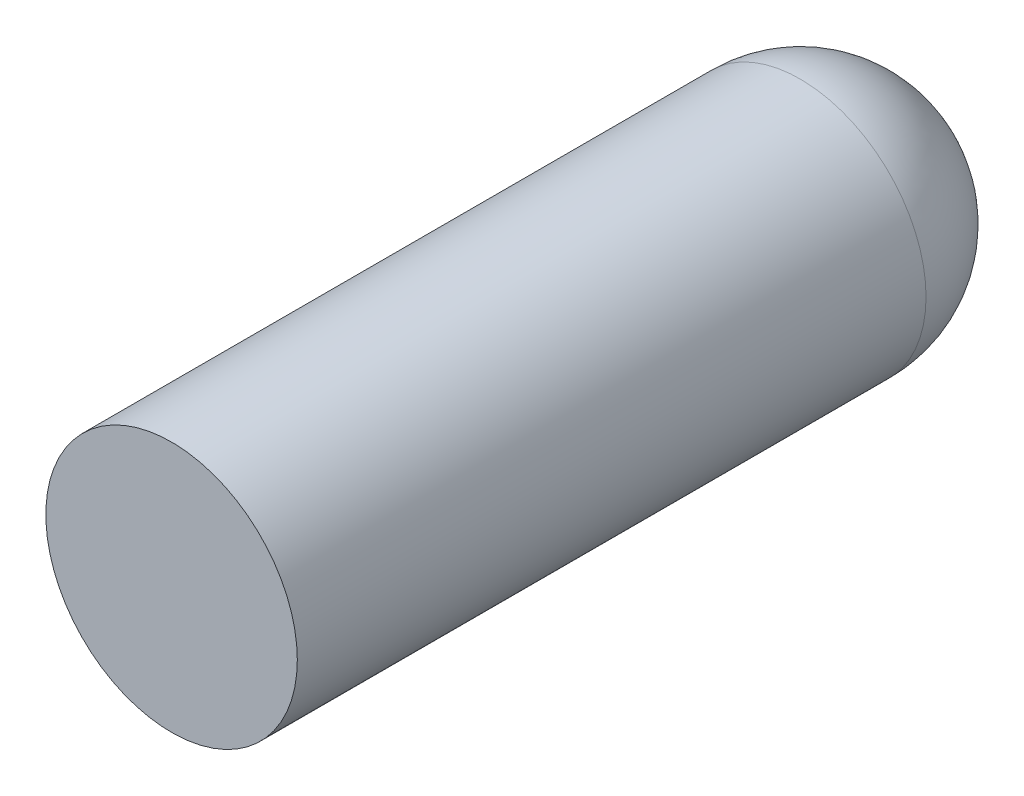
ISO-10303-21;
HEADER;
FILE_DESCRIPTION(('STEP AP214'),'2;1');
FILE_NAME('part.step','',(''),(''),'','','');
FILE_SCHEMA(('AUTOMOTIVE_DESIGN { 1 0 10303 214 1 1 1 1 }'));
ENDSEC;
DATA;
#1=APPLICATION_CONTEXT('core data for automotive mechanical design processes');
#2=APPLICATION_PROTOCOL_DEFINITION('international standard','automotive_design',2000,#1);
#3=PRODUCT_CONTEXT('',#1,'mechanical');
#4=PRODUCT('Part','Part','',(#3));
#5=PRODUCT_RELATED_PRODUCT_CATEGORY('part','',(#4));
#6=PRODUCT_DEFINITION_FORMATION('','',#4);
#7=PRODUCT_DEFINITION_CONTEXT('part definition',#1,'design');
#8=PRODUCT_DEFINITION('design','',#6,#7);
#9=PRODUCT_DEFINITION_SHAPE('','',#8);
#10=(LENGTH_UNIT() NAMED_UNIT(*) SI_UNIT(.MILLI.,.METRE.));
#11=(NAMED_UNIT(*) PLANE_ANGLE_UNIT() SI_UNIT($,.RADIAN.));
#12=(NAMED_UNIT(*) SI_UNIT($,.STERADIAN.) SOLID_ANGLE_UNIT());
#13=UNCERTAINTY_MEASURE_WITH_UNIT(LENGTH_MEASURE(1.E-05),#10,'distance_accuracy_value','');
#14=(GEOMETRIC_REPRESENTATION_CONTEXT(3) GLOBAL_UNCERTAINTY_ASSIGNED_CONTEXT((#13)) GLOBAL_UNIT_ASSIGNED_CONTEXT((#10,
#11,#12)) REPRESENTATION_CONTEXT('',''));
#15=CARTESIAN_POINT('',(0.,0.,0.));
#16=DIRECTION('',(0.,0.,1.));
#17=DIRECTION('',(1.,0.,0.));
#18=AXIS2_PLACEMENT_3D('',#15,#16,#17);
#19=CARTESIAN_POINT('',(0.,0.,50.));
#20=DIRECTION('',(0.,0.,-1.));
#21=DIRECTION('',(-1.,0.,0.));
#22=AXIS2_PLACEMENT_3D('',#19,#20,#21);
#23=CYLINDRICAL_SURFACE('',#22,10.);
#24=CARTESIAN_POINT('',(0.,0.,50.));
#25=DIRECTION('',(0.,0.,1.));
#26=DIRECTION('',(1.,0.,0.));
#27=AXIS2_PLACEMENT_3D('',#24,#25,#26);
#28=CIRCLE('',#27,10.);
#29=CARTESIAN_POINT('',(10.,0.,50.));
#30=VERTEX_POINT('',#29);
#31=EDGE_CURVE('E10',#30,#30,#28,.T.);
#32=ORIENTED_EDGE('',*,*,#31,.F.);
#33=EDGE_LOOP('',(#32));
#34=FACE_BOUND('',#33,.T.);
#35=CARTESIAN_POINT('',(0.,0.,0.));
#36=DIRECTION('',(0.,0.,1.));
#37=DIRECTION('',(1.,0.,0.));
#38=AXIS2_PLACEMENT_3D('',#35,#36,#37);
#39=CIRCLE('',#38,10.);
#40=CARTESIAN_POINT('',(10.,0.,0.));
#41=VERTEX_POINT('',#40);
#42=EDGE_CURVE('E45',#41,#41,#39,.F.);
#43=ORIENTED_EDGE('',*,*,#42,.F.);
#44=EDGE_LOOP('',(#43));
#45=FACE_BOUND('',#44,.T.);
#46=ADVANCED_FACE('F39',(#34,#45),#23,.T.);
#47=CARTESIAN_POINT('',(0.,0.,50.));
#48=DIRECTION('',(0.,0.,1.));
#49=DIRECTION('',(1.,0.,0.));
#50=AXIS2_PLACEMENT_3D('',#47,#48,#49);
#51=PLANE('',#50);
#52=ORIENTED_EDGE('',*,*,#31,.T.);
#53=EDGE_LOOP('',(#52));
#54=FACE_BOUND('',#53,.T.);
#55=ADVANCED_FACE('F54',(#54),#51,.T.);
#56=CARTESIAN_POINT('',(0.,0.,0.));
#57=DIRECTION('',(0.,0.,-1.));
#58=DIRECTION('',(1.,0.,0.));
#59=AXIS2_PLACEMENT_3D('',#56,#57,#58);
#60=SPHERICAL_SURFACE('',#59,10.);
#61=ORIENTED_EDGE('',*,*,#42,.T.);
#62=EDGE_LOOP('',(#61));
#63=FACE_BOUND('',#62,.T.);
#64=ADVANCED_FACE('F51',(#63),#60,.T.);
#65=CLOSED_SHELL('',(#46,#55,#64));
#66=MANIFOLD_SOLID_BREP('B2',#65);
#67=ADVANCED_BREP_SHAPE_REPRESENTATION('',(#18,#66),#14);
#68=SHAPE_DEFINITION_REPRESENTATION(#9,#67);
ENDSEC;
END-ISO-10303-21;
